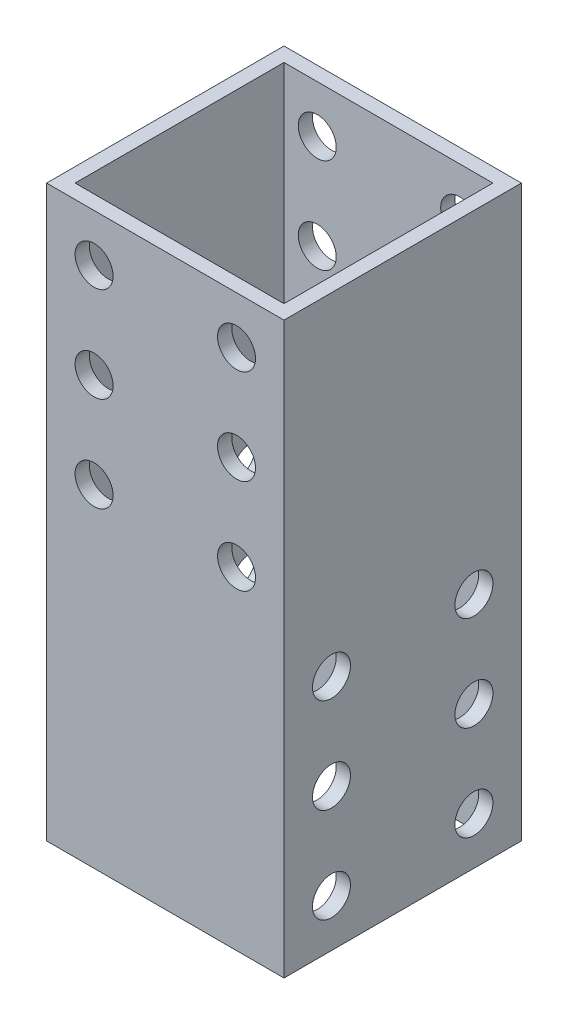
ISO-10303-21;
HEADER;
FILE_DESCRIPTION(('STEP AP214'),'2;1');
FILE_NAME('part.step','',(''),(''),'','','');
FILE_SCHEMA(('AUTOMOTIVE_DESIGN { 1 0 10303 214 1 1 1 1 }'));
ENDSEC;
DATA;
#1=APPLICATION_CONTEXT('core data for automotive mechanical design processes');
#2=APPLICATION_PROTOCOL_DEFINITION('international standard','automotive_design',2000,#1);
#3=PRODUCT_CONTEXT('',#1,'mechanical');
#4=PRODUCT('Part','Part','',(#3));
#5=PRODUCT_RELATED_PRODUCT_CATEGORY('part','',(#4));
#6=PRODUCT_DEFINITION_FORMATION('','',#4);
#7=PRODUCT_DEFINITION_CONTEXT('part definition',#1,'design');
#8=PRODUCT_DEFINITION('design','',#6,#7);
#9=PRODUCT_DEFINITION_SHAPE('','',#8);
#10=(LENGTH_UNIT() NAMED_UNIT(*) SI_UNIT(.MILLI.,.METRE.));
#11=(NAMED_UNIT(*) PLANE_ANGLE_UNIT() SI_UNIT($,.RADIAN.));
#12=(NAMED_UNIT(*) SI_UNIT($,.STERADIAN.) SOLID_ANGLE_UNIT());
#13=UNCERTAINTY_MEASURE_WITH_UNIT(LENGTH_MEASURE(1.E-05),#10,'distance_accuracy_value','');
#14=(GEOMETRIC_REPRESENTATION_CONTEXT(3) GLOBAL_UNCERTAINTY_ASSIGNED_CONTEXT((#13)) GLOBAL_UNIT_ASSIGNED_CONTEXT((#10,
#11,#12)) REPRESENTATION_CONTEXT('',''));
#15=CARTESIAN_POINT('',(0.,0.,0.));
#16=DIRECTION('',(0.,0.,1.));
#17=DIRECTION('',(1.,0.,0.));
#18=AXIS2_PLACEMENT_3D('',#15,#16,#17);
#19=CARTESIAN_POINT('',(12.5,-30.,-12.5));
#20=DIRECTION('',(1.,0.,0.));
#21=DIRECTION('',(0.,0.,-1.));
#22=AXIS2_PLACEMENT_3D('',#19,#20,#21);
#23=PLANE('',#22);
#24=CARTESIAN_POINT('',(12.5,-5.,-7.5));
#25=DIRECTION('',(1.,0.,0.));
#26=DIRECTION('',(0.,0.,-1.));
#27=AXIS2_PLACEMENT_3D('',#24,#25,#26);
#28=CIRCLE('',#27,2.);
#29=CARTESIAN_POINT('',(12.5,-5.,-9.5));
#30=VERTEX_POINT('',#29);
#31=EDGE_CURVE('E238',#30,#30,#28,.T.);
#32=ORIENTED_EDGE('',*,*,#31,.F.);
#33=EDGE_LOOP('',(#32));
#34=FACE_BOUND('',#33,.T.);
#35=CARTESIAN_POINT('',(12.5,-15.,-7.5));
#36=DIRECTION('',(1.,0.,0.));
#37=DIRECTION('',(0.,0.,-1.));
#38=AXIS2_PLACEMENT_3D('',#35,#36,#37);
#39=CIRCLE('',#38,2.);
#40=CARTESIAN_POINT('',(12.5,-15.,-9.5));
#41=VERTEX_POINT('',#40);
#42=EDGE_CURVE('E244',#41,#41,#39,.T.);
#43=ORIENTED_EDGE('',*,*,#42,.F.);
#44=EDGE_LOOP('',(#43));
#45=FACE_BOUND('',#44,.T.);
#46=CARTESIAN_POINT('',(12.5,-25.,7.5));
#47=DIRECTION('',(1.,0.,0.));
#48=DIRECTION('',(0.,0.,-1.));
#49=AXIS2_PLACEMENT_3D('',#46,#47,#48);
#50=CIRCLE('',#49,2.00000000000001);
#51=CARTESIAN_POINT('',(12.5,-25.,5.49999999999999));
#52=VERTEX_POINT('',#51);
#53=EDGE_CURVE('E250',#52,#52,#50,.T.);
#54=ORIENTED_EDGE('',*,*,#53,.F.);
#55=EDGE_LOOP('',(#54));
#56=FACE_BOUND('',#55,.T.);
#57=CARTESIAN_POINT('',(12.5,-5.,7.5));
#58=DIRECTION('',(1.,0.,0.));
#59=DIRECTION('',(0.,0.,-1.));
#60=AXIS2_PLACEMENT_3D('',#57,#58,#59);
#61=CIRCLE('',#60,2.00000000000001);
#62=CARTESIAN_POINT('',(12.5,-5.,5.49999999999999));
#63=VERTEX_POINT('',#62);
#64=EDGE_CURVE('E231',#63,#63,#61,.T.);
#65=ORIENTED_EDGE('',*,*,#64,.F.);
#66=EDGE_LOOP('',(#65));
#67=FACE_BOUND('',#66,.T.);
#68=CARTESIAN_POINT('',(12.5,-15.,7.5));
#69=DIRECTION('',(1.,0.,0.));
#70=DIRECTION('',(0.,0.,-1.));
#71=AXIS2_PLACEMENT_3D('',#68,#69,#70);
#72=CIRCLE('',#71,2.);
#73=CARTESIAN_POINT('',(12.5,-15.,5.49999999999999));
#74=VERTEX_POINT('',#73);
#75=EDGE_CURVE('E227',#74,#74,#72,.T.);
#76=ORIENTED_EDGE('',*,*,#75,.F.);
#77=EDGE_LOOP('',(#76));
#78=FACE_BOUND('',#77,.T.);
#79=CARTESIAN_POINT('',(12.5,-25.,-7.5));
#80=DIRECTION('',(1.,0.,0.));
#81=DIRECTION('',(0.,0.,-1.));
#82=AXIS2_PLACEMENT_3D('',#79,#80,#81);
#83=CIRCLE('',#82,2.);
#84=CARTESIAN_POINT('',(12.5,-25.,-9.5));
#85=VERTEX_POINT('',#84);
#86=EDGE_CURVE('E237',#85,#85,#83,.T.);
#87=ORIENTED_EDGE('',*,*,#86,.F.);
#88=EDGE_LOOP('',(#87));
#89=FACE_BOUND('',#88,.T.);
#90=DIRECTION('',(0.,1.,0.));
#91=VECTOR('',#90,1.);
#92=CARTESIAN_POINT('',(12.5,-30.,-12.5));
#93=LINE('',#92,#91);
#94=CARTESIAN_POINT('',(12.5,-30.,-12.5));
#95=VERTEX_POINT('',#94);
#96=CARTESIAN_POINT('',(12.5,30.,-12.5));
#97=VERTEX_POINT('',#96);
#98=EDGE_CURVE('E164',#95,#97,#93,.T.);
#99=ORIENTED_EDGE('',*,*,#98,.T.);
#100=DIRECTION('',(0.,0.,-1.));
#101=VECTOR('',#100,1.);
#102=CARTESIAN_POINT('',(12.5,30.,-12.5));
#103=LINE('',#102,#101);
#104=CARTESIAN_POINT('',(12.5,30.,12.5));
#105=VERTEX_POINT('',#104);
#106=EDGE_CURVE('E132',#105,#97,#103,.T.);
#107=ORIENTED_EDGE('',*,*,#106,.F.);
#108=DIRECTION('',(0.,1.,0.));
#109=VECTOR('',#108,1.);
#110=CARTESIAN_POINT('',(12.5,-30.,12.5));
#111=LINE('',#110,#109);
#112=CARTESIAN_POINT('',(12.5,-30.,12.5));
#113=VERTEX_POINT('',#112);
#114=EDGE_CURVE('E11',#113,#105,#111,.T.);
#115=ORIENTED_EDGE('',*,*,#114,.F.);
#116=DIRECTION('',(0.,0.,-1.));
#117=VECTOR('',#116,1.);
#118=CARTESIAN_POINT('',(12.5,-30.,-12.5));
#119=LINE('',#118,#117);
#120=EDGE_CURVE('E151',#113,#95,#119,.T.);
#121=ORIENTED_EDGE('',*,*,#120,.T.);
#122=EDGE_LOOP('',(#99,#107,#115,#121));
#123=FACE_BOUND('',#122,.T.);
#124=ADVANCED_FACE('F35',(#34,#45,#56,#67,#78,#89,#123),#23,.T.);
#125=CARTESIAN_POINT('',(-12.5,-30.,12.5));
#126=DIRECTION('',(0.,0.,1.));
#127=DIRECTION('',(1.,0.,0.));
#128=AXIS2_PLACEMENT_3D('',#125,#126,#127);
#129=PLANE('',#128);
#130=CARTESIAN_POINT('',(7.5,15.,12.5));
#131=DIRECTION('',(0.,0.,-1.));
#132=DIRECTION('',(-1.,0.,0.));
#133=AXIS2_PLACEMENT_3D('',#130,#131,#132);
#134=CIRCLE('',#133,2.);
#135=CARTESIAN_POINT('',(5.5,15.,12.5));
#136=VERTEX_POINT('',#135);
#137=EDGE_CURVE('E584',#136,#136,#134,.T.);
#138=ORIENTED_EDGE('',*,*,#137,.T.);
#139=EDGE_LOOP('',(#138));
#140=FACE_BOUND('',#139,.T.);
#141=CARTESIAN_POINT('',(7.5,25.,12.5));
#142=DIRECTION('',(0.,0.,-1.));
#143=DIRECTION('',(-1.,0.,0.));
#144=AXIS2_PLACEMENT_3D('',#141,#142,#143);
#145=CIRCLE('',#144,2.);
#146=CARTESIAN_POINT('',(5.5,25.,12.5));
#147=VERTEX_POINT('',#146);
#148=EDGE_CURVE('E610',#147,#147,#145,.T.);
#149=ORIENTED_EDGE('',*,*,#148,.T.);
#150=EDGE_LOOP('',(#149));
#151=FACE_BOUND('',#150,.T.);
#152=CARTESIAN_POINT('',(7.5,5.,12.5));
#153=DIRECTION('',(0.,0.,-1.));
#154=DIRECTION('',(-1.,0.,0.));
#155=AXIS2_PLACEMENT_3D('',#152,#153,#154);
#156=CIRCLE('',#155,2.);
#157=CARTESIAN_POINT('',(5.5,5.,12.5));
#158=VERTEX_POINT('',#157);
#159=EDGE_CURVE('E609',#158,#158,#156,.T.);
#160=ORIENTED_EDGE('',*,*,#159,.T.);
#161=EDGE_LOOP('',(#160));
#162=FACE_BOUND('',#161,.T.);
#163=CARTESIAN_POINT('',(-7.5,15.,12.5));
#164=DIRECTION('',(0.,0.,-1.));
#165=DIRECTION('',(-1.,0.,0.));
#166=AXIS2_PLACEMENT_3D('',#163,#164,#165);
#167=CIRCLE('',#166,2.);
#168=CARTESIAN_POINT('',(-9.5,15.,12.5));
#169=VERTEX_POINT('',#168);
#170=EDGE_CURVE('E603',#169,#169,#167,.T.);
#171=ORIENTED_EDGE('',*,*,#170,.T.);
#172=EDGE_LOOP('',(#171));
#173=FACE_BOUND('',#172,.T.);
#174=CARTESIAN_POINT('',(-7.5,5.,12.5));
#175=DIRECTION('',(0.,0.,-1.));
#176=DIRECTION('',(-1.,0.,0.));
#177=AXIS2_PLACEMENT_3D('',#174,#175,#176);
#178=CIRCLE('',#177,2.);
#179=CARTESIAN_POINT('',(-9.5,5.,12.5));
#180=VERTEX_POINT('',#179);
#181=EDGE_CURVE('E621',#180,#180,#178,.T.);
#182=ORIENTED_EDGE('',*,*,#181,.T.);
#183=EDGE_LOOP('',(#182));
#184=FACE_BOUND('',#183,.T.);
#185=CARTESIAN_POINT('',(-7.5,25.,12.5));
#186=DIRECTION('',(0.,0.,-1.));
#187=DIRECTION('',(-1.,0.,0.));
#188=AXIS2_PLACEMENT_3D('',#185,#186,#187);
#189=CIRCLE('',#188,2.);
#190=CARTESIAN_POINT('',(-9.5,25.,12.5));
#191=VERTEX_POINT('',#190);
#192=EDGE_CURVE('E198',#191,#191,#189,.T.);
#193=ORIENTED_EDGE('',*,*,#192,.T.);
#194=EDGE_LOOP('',(#193));
#195=FACE_BOUND('',#194,.T.);
#196=ORIENTED_EDGE('',*,*,#114,.T.);
#197=DIRECTION('',(1.,0.,0.));
#198=VECTOR('',#197,1.);
#199=CARTESIAN_POINT('',(-12.5,30.,12.5));
#200=LINE('',#199,#198);
#201=CARTESIAN_POINT('',(-12.5,30.,12.5));
#202=VERTEX_POINT('',#201);
#203=EDGE_CURVE('E141',#202,#105,#200,.T.);
#204=ORIENTED_EDGE('',*,*,#203,.F.);
#205=DIRECTION('',(0.,1.,0.));
#206=VECTOR('',#205,1.);
#207=CARTESIAN_POINT('',(-12.5,-30.,12.5));
#208=LINE('',#207,#206);
#209=CARTESIAN_POINT('',(-12.5,-30.,12.5));
#210=VERTEX_POINT('',#209);
#211=EDGE_CURVE('E43',#210,#202,#208,.T.);
#212=ORIENTED_EDGE('',*,*,#211,.F.);
#213=DIRECTION('',(1.,0.,0.));
#214=VECTOR('',#213,1.);
#215=CARTESIAN_POINT('',(-12.5,-30.,12.5));
#216=LINE('',#215,#214);
#217=EDGE_CURVE('E162',#210,#113,#216,.T.);
#218=ORIENTED_EDGE('',*,*,#217,.T.);
#219=EDGE_LOOP('',(#196,#204,#212,#218));
#220=FACE_BOUND('',#219,.T.);
#221=ADVANCED_FACE('F300',(#140,#151,#162,#173,#184,#195,#220),#129,.T.);
#222=CARTESIAN_POINT('',(-12.5,-30.,-12.5));
#223=DIRECTION('',(-1.,0.,0.));
#224=DIRECTION('',(0.,0.,1.));
#225=AXIS2_PLACEMENT_3D('',#222,#223,#224);
#226=PLANE('',#225);
#227=CARTESIAN_POINT('',(-12.5,-5.,-7.5));
#228=DIRECTION('',(1.,0.,0.));
#229=DIRECTION('',(0.,0.,-1.));
#230=AXIS2_PLACEMENT_3D('',#227,#228,#229);
#231=CIRCLE('',#230,2.);
#232=CARTESIAN_POINT('',(-12.5,-5.,-9.5));
#233=VERTEX_POINT('',#232);
#234=EDGE_CURVE('E234',#233,#233,#231,.T.);
#235=ORIENTED_EDGE('',*,*,#234,.T.);
#236=EDGE_LOOP('',(#235));
#237=FACE_BOUND('',#236,.T.);
#238=CARTESIAN_POINT('',(-12.5,-15.,-7.5));
#239=DIRECTION('',(1.,0.,0.));
#240=DIRECTION('',(0.,0.,-1.));
#241=AXIS2_PLACEMENT_3D('',#238,#239,#240);
#242=CIRCLE('',#241,2.);
#243=CARTESIAN_POINT('',(-12.5,-15.,-9.5));
#244=VERTEX_POINT('',#243);
#245=EDGE_CURVE('E241',#244,#244,#242,.T.);
#246=ORIENTED_EDGE('',*,*,#245,.T.);
#247=EDGE_LOOP('',(#246));
#248=FACE_BOUND('',#247,.T.);
#249=CARTESIAN_POINT('',(-12.5,-25.,7.5));
#250=DIRECTION('',(1.,0.,0.));
#251=DIRECTION('',(0.,0.,-1.));
#252=AXIS2_PLACEMENT_3D('',#249,#250,#251);
#253=CIRCLE('',#252,2.00000000000001);
#254=CARTESIAN_POINT('',(-12.5,-25.,5.49999999999999));
#255=VERTEX_POINT('',#254);
#256=EDGE_CURVE('E247',#255,#255,#253,.T.);
#257=ORIENTED_EDGE('',*,*,#256,.T.);
#258=EDGE_LOOP('',(#257));
#259=FACE_BOUND('',#258,.T.);
#260=CARTESIAN_POINT('',(-12.5,-5.,7.5));
#261=DIRECTION('',(1.,0.,0.));
#262=DIRECTION('',(0.,0.,-1.));
#263=AXIS2_PLACEMENT_3D('',#260,#261,#262);
#264=CIRCLE('',#263,2.00000000000001);
#265=CARTESIAN_POINT('',(-12.5,-5.,5.49999999999999));
#266=VERTEX_POINT('',#265);
#267=EDGE_CURVE('E253',#266,#266,#264,.T.);
#268=ORIENTED_EDGE('',*,*,#267,.T.);
#269=EDGE_LOOP('',(#268));
#270=FACE_BOUND('',#269,.T.);
#271=CARTESIAN_POINT('',(-12.5,-15.,7.5));
#272=DIRECTION('',(1.,0.,0.));
#273=DIRECTION('',(0.,0.,-1.));
#274=AXIS2_PLACEMENT_3D('',#271,#272,#273);
#275=CIRCLE('',#274,2.);
#276=CARTESIAN_POINT('',(-12.5,-15.,5.49999999999999));
#277=VERTEX_POINT('',#276);
#278=EDGE_CURVE('E228',#277,#277,#275,.T.);
#279=ORIENTED_EDGE('',*,*,#278,.T.);
#280=EDGE_LOOP('',(#279));
#281=FACE_BOUND('',#280,.T.);
#282=CARTESIAN_POINT('',(-12.5,-25.,-7.5));
#283=DIRECTION('',(1.,0.,0.));
#284=DIRECTION('',(0.,0.,-1.));
#285=AXIS2_PLACEMENT_3D('',#282,#283,#284);
#286=CIRCLE('',#285,2.);
#287=CARTESIAN_POINT('',(-12.5,-25.,-9.5));
#288=VERTEX_POINT('',#287);
#289=EDGE_CURVE('E174',#288,#288,#286,.T.);
#290=ORIENTED_EDGE('',*,*,#289,.T.);
#291=EDGE_LOOP('',(#290));
#292=FACE_BOUND('',#291,.T.);
#293=ORIENTED_EDGE('',*,*,#211,.T.);
#294=DIRECTION('',(0.,0.,1.));
#295=VECTOR('',#294,1.);
#296=CARTESIAN_POINT('',(-12.5,30.,-12.5));
#297=LINE('',#296,#295);
#298=CARTESIAN_POINT('',(-12.5,30.,-12.5));
#299=VERTEX_POINT('',#298);
#300=EDGE_CURVE('E138',#299,#202,#297,.T.);
#301=ORIENTED_EDGE('',*,*,#300,.F.);
#302=DIRECTION('',(0.,1.,0.));
#303=VECTOR('',#302,1.);
#304=CARTESIAN_POINT('',(-12.5,-30.,-12.5));
#305=LINE('',#304,#303);
#306=CARTESIAN_POINT('',(-12.5,-30.,-12.5));
#307=VERTEX_POINT('',#306);
#308=EDGE_CURVE('E167',#307,#299,#305,.T.);
#309=ORIENTED_EDGE('',*,*,#308,.F.);
#310=DIRECTION('',(0.,0.,1.));
#311=VECTOR('',#310,1.);
#312=CARTESIAN_POINT('',(-12.5,-30.,-12.5));
#313=LINE('',#312,#311);
#314=EDGE_CURVE('E159',#307,#210,#313,.T.);
#315=ORIENTED_EDGE('',*,*,#314,.T.);
#316=EDGE_LOOP('',(#293,#301,#309,#315));
#317=FACE_BOUND('',#316,.T.);
#318=ADVANCED_FACE('F305',(#237,#248,#259,#270,#281,#292,#317),#226,.T.);
#319=CARTESIAN_POINT('',(-12.5,-30.,-12.5));
#320=DIRECTION('',(0.,0.,-1.));
#321=DIRECTION('',(-1.,0.,0.));
#322=AXIS2_PLACEMENT_3D('',#319,#320,#321);
#323=PLANE('',#322);
#324=CARTESIAN_POINT('',(7.5,15.,-12.5));
#325=DIRECTION('',(0.,0.,-1.));
#326=DIRECTION('',(-1.,0.,0.));
#327=AXIS2_PLACEMENT_3D('',#324,#325,#326);
#328=CIRCLE('',#327,2.);
#329=CARTESIAN_POINT('',(5.5,15.,-12.5));
#330=VERTEX_POINT('',#329);
#331=EDGE_CURVE('E618',#330,#330,#328,.T.);
#332=ORIENTED_EDGE('',*,*,#331,.F.);
#333=EDGE_LOOP('',(#332));
#334=FACE_BOUND('',#333,.T.);
#335=CARTESIAN_POINT('',(7.5,25.,-12.5));
#336=DIRECTION('',(0.,0.,-1.));
#337=DIRECTION('',(-1.,0.,0.));
#338=AXIS2_PLACEMENT_3D('',#335,#336,#337);
#339=CIRCLE('',#338,2.);
#340=CARTESIAN_POINT('',(5.5,25.,-12.5));
#341=VERTEX_POINT('',#340);
#342=EDGE_CURVE('E623',#341,#341,#339,.T.);
#343=ORIENTED_EDGE('',*,*,#342,.F.);
#344=EDGE_LOOP('',(#343));
#345=FACE_BOUND('',#344,.T.);
#346=CARTESIAN_POINT('',(7.5,5.,-12.5));
#347=DIRECTION('',(0.,0.,-1.));
#348=DIRECTION('',(-1.,0.,0.));
#349=AXIS2_PLACEMENT_3D('',#346,#347,#348);
#350=CIRCLE('',#349,2.);
#351=CARTESIAN_POINT('',(5.5,5.,-12.5));
#352=VERTEX_POINT('',#351);
#353=EDGE_CURVE('E606',#352,#352,#350,.T.);
#354=ORIENTED_EDGE('',*,*,#353,.F.);
#355=EDGE_LOOP('',(#354));
#356=FACE_BOUND('',#355,.T.);
#357=CARTESIAN_POINT('',(-7.5,15.,-12.5));
#358=DIRECTION('',(0.,0.,-1.));
#359=DIRECTION('',(-1.,0.,0.));
#360=AXIS2_PLACEMENT_3D('',#357,#358,#359);
#361=CIRCLE('',#360,2.);
#362=CARTESIAN_POINT('',(-9.5,15.,-12.5));
#363=VERTEX_POINT('',#362);
#364=EDGE_CURVE('E613',#363,#363,#361,.T.);
#365=ORIENTED_EDGE('',*,*,#364,.F.);
#366=EDGE_LOOP('',(#365));
#367=FACE_BOUND('',#366,.T.);
#368=CARTESIAN_POINT('',(-7.5,5.,-12.5));
#369=DIRECTION('',(0.,0.,-1.));
#370=DIRECTION('',(-1.,0.,0.));
#371=AXIS2_PLACEMENT_3D('',#368,#369,#370);
#372=CIRCLE('',#371,2.);
#373=CARTESIAN_POINT('',(-9.5,5.,-12.5));
#374=VERTEX_POINT('',#373);
#375=EDGE_CURVE('E628',#374,#374,#372,.T.);
#376=ORIENTED_EDGE('',*,*,#375,.F.);
#377=EDGE_LOOP('',(#376));
#378=FACE_BOUND('',#377,.T.);
#379=CARTESIAN_POINT('',(-7.5,25.,-12.5));
#380=DIRECTION('',(0.,0.,-1.));
#381=DIRECTION('',(-1.,0.,0.));
#382=AXIS2_PLACEMENT_3D('',#379,#380,#381);
#383=CIRCLE('',#382,2.);
#384=CARTESIAN_POINT('',(-9.5,25.,-12.5));
#385=VERTEX_POINT('',#384);
#386=EDGE_CURVE('E600',#385,#385,#383,.T.);
#387=ORIENTED_EDGE('',*,*,#386,.F.);
#388=EDGE_LOOP('',(#387));
#389=FACE_BOUND('',#388,.T.);
#390=ORIENTED_EDGE('',*,*,#308,.T.);
#391=DIRECTION('',(-1.,0.,0.));
#392=VECTOR('',#391,1.);
#393=CARTESIAN_POINT('',(-12.5,30.,-12.5));
#394=LINE('',#393,#392);
#395=EDGE_CURVE('E135',#97,#299,#394,.T.);
#396=ORIENTED_EDGE('',*,*,#395,.F.);
#397=ORIENTED_EDGE('',*,*,#98,.F.);
#398=DIRECTION('',(-1.,0.,0.));
#399=VECTOR('',#398,1.);
#400=CARTESIAN_POINT('',(-12.5,-30.,-12.5));
#401=LINE('',#400,#399);
#402=EDGE_CURVE('E156',#95,#307,#401,.T.);
#403=ORIENTED_EDGE('',*,*,#402,.T.);
#404=EDGE_LOOP('',(#390,#396,#397,#403));
#405=FACE_BOUND('',#404,.T.);
#406=ADVANCED_FACE('F322',(#334,#345,#356,#367,#378,#389,#405),#323,.T.);
#407=CARTESIAN_POINT('',(0.,-30.,0.));
#408=DIRECTION('',(0.,1.,0.));
#409=DIRECTION('',(0.,0.,1.));
#410=AXIS2_PLACEMENT_3D('',#407,#408,#409);
#411=PLANE('',#410);
#412=DIRECTION('',(1.,0.,0.));
#413=VECTOR('',#412,1.);
#414=CARTESIAN_POINT('',(-11.,-30.,11.));
#415=LINE('',#414,#413);
#416=CARTESIAN_POINT('',(-11.,-30.,11.));
#417=VERTEX_POINT('',#416);
#418=CARTESIAN_POINT('',(11.,-30.,11.));
#419=VERTEX_POINT('',#418);
#420=EDGE_CURVE('E112',#417,#419,#415,.T.);
#421=ORIENTED_EDGE('',*,*,#420,.T.);
#422=DIRECTION('',(0.,0.,-1.));
#423=VECTOR('',#422,1.);
#424=CARTESIAN_POINT('',(11.,-30.,-11.));
#425=LINE('',#424,#423);
#426=CARTESIAN_POINT('',(11.,-30.,-11.));
#427=VERTEX_POINT('',#426);
#428=EDGE_CURVE('E144',#419,#427,#425,.T.);
#429=ORIENTED_EDGE('',*,*,#428,.T.);
#430=DIRECTION('',(-1.,0.,0.));
#431=VECTOR('',#430,1.);
#432=CARTESIAN_POINT('',(-11.,-30.,-11.));
#433=LINE('',#432,#431);
#434=CARTESIAN_POINT('',(-11.,-30.,-11.));
#435=VERTEX_POINT('',#434);
#436=EDGE_CURVE('E107',#427,#435,#433,.T.);
#437=ORIENTED_EDGE('',*,*,#436,.T.);
#438=DIRECTION('',(0.,0.,1.));
#439=VECTOR('',#438,1.);
#440=CARTESIAN_POINT('',(-11.,-30.,-11.));
#441=LINE('',#440,#439);
#442=EDGE_CURVE('E51',#435,#417,#441,.T.);
#443=ORIENTED_EDGE('',*,*,#442,.T.);
#444=EDGE_LOOP('',(#421,#429,#437,#443));
#445=FACE_BOUND('',#444,.T.);
#446=ORIENTED_EDGE('',*,*,#120,.F.);
#447=ORIENTED_EDGE('',*,*,#217,.F.);
#448=ORIENTED_EDGE('',*,*,#314,.F.);
#449=ORIENTED_EDGE('',*,*,#402,.F.);
#450=EDGE_LOOP('',(#446,#447,#448,#449));
#451=FACE_BOUND('',#450,.T.);
#452=ADVANCED_FACE('F330',(#445,#451),#411,.F.);
#453=CARTESIAN_POINT('',(11.,-30.,-11.));
#454=DIRECTION('',(1.,0.,0.));
#455=DIRECTION('',(0.,0.,-1.));
#456=AXIS2_PLACEMENT_3D('',#453,#454,#455);
#457=PLANE('',#456);
#458=CARTESIAN_POINT('',(11.,-5.,-7.5));
#459=DIRECTION('',(1.,0.,0.));
#460=DIRECTION('',(0.,0.,-1.));
#461=AXIS2_PLACEMENT_3D('',#458,#459,#460);
#462=CIRCLE('',#461,2.);
#463=CARTESIAN_POINT('',(11.,-5.,-9.5));
#464=VERTEX_POINT('',#463);
#465=EDGE_CURVE('E121',#464,#464,#462,.T.);
#466=ORIENTED_EDGE('',*,*,#465,.T.);
#467=EDGE_LOOP('',(#466));
#468=FACE_BOUND('',#467,.T.);
#469=CARTESIAN_POINT('',(11.,-15.,-7.5));
#470=DIRECTION('',(1.,0.,0.));
#471=DIRECTION('',(0.,0.,-1.));
#472=AXIS2_PLACEMENT_3D('',#469,#470,#471);
#473=CIRCLE('',#472,2.);
#474=CARTESIAN_POINT('',(11.,-15.,-9.5));
#475=VERTEX_POINT('',#474);
#476=EDGE_CURVE('E190',#475,#475,#473,.T.);
#477=ORIENTED_EDGE('',*,*,#476,.T.);
#478=EDGE_LOOP('',(#477));
#479=FACE_BOUND('',#478,.T.);
#480=CARTESIAN_POINT('',(11.,-25.,7.5));
#481=DIRECTION('',(1.,0.,0.));
#482=DIRECTION('',(0.,0.,-1.));
#483=AXIS2_PLACEMENT_3D('',#480,#481,#482);
#484=CIRCLE('',#483,2.00000000000001);
#485=CARTESIAN_POINT('',(11.,-25.,5.49999999999999));
#486=VERTEX_POINT('',#485);
#487=EDGE_CURVE('E186',#486,#486,#484,.T.);
#488=ORIENTED_EDGE('',*,*,#487,.T.);
#489=EDGE_LOOP('',(#488));
#490=FACE_BOUND('',#489,.T.);
#491=CARTESIAN_POINT('',(11.,-5.,7.5));
#492=DIRECTION('',(1.,0.,0.));
#493=DIRECTION('',(0.,0.,-1.));
#494=AXIS2_PLACEMENT_3D('',#491,#492,#493);
#495=CIRCLE('',#494,2.00000000000001);
#496=CARTESIAN_POINT('',(11.,-5.,5.49999999999999));
#497=VERTEX_POINT('',#496);
#498=EDGE_CURVE('E182',#497,#497,#495,.T.);
#499=ORIENTED_EDGE('',*,*,#498,.T.);
#500=EDGE_LOOP('',(#499));
#501=FACE_BOUND('',#500,.T.);
#502=CARTESIAN_POINT('',(11.,-15.,7.5));
#503=DIRECTION('',(1.,0.,0.));
#504=DIRECTION('',(0.,0.,-1.));
#505=AXIS2_PLACEMENT_3D('',#502,#503,#504);
#506=CIRCLE('',#505,2.);
#507=CARTESIAN_POINT('',(11.,-15.,5.49999999999999));
#508=VERTEX_POINT('',#507);
#509=EDGE_CURVE('E178',#508,#508,#506,.T.);
#510=ORIENTED_EDGE('',*,*,#509,.T.);
#511=EDGE_LOOP('',(#510));
#512=FACE_BOUND('',#511,.T.);
#513=CARTESIAN_POINT('',(11.,-25.,-7.5));
#514=DIRECTION('',(1.,0.,0.));
#515=DIRECTION('',(0.,0.,-1.));
#516=AXIS2_PLACEMENT_3D('',#513,#514,#515);
#517=CIRCLE('',#516,2.);
#518=CARTESIAN_POINT('',(11.,-25.,-9.5));
#519=VERTEX_POINT('',#518);
#520=EDGE_CURVE('E173',#519,#519,#517,.T.);
#521=ORIENTED_EDGE('',*,*,#520,.T.);
#522=EDGE_LOOP('',(#521));
#523=FACE_BOUND('',#522,.T.);
#524=DIRECTION('',(0.,1.,0.));
#525=VECTOR('',#524,1.);
#526=CARTESIAN_POINT('',(11.,-30.,11.));
#527=LINE('',#526,#525);
#528=CARTESIAN_POINT('',(11.,30.,11.));
#529=VERTEX_POINT('',#528);
#530=EDGE_CURVE('E117',#419,#529,#527,.T.);
#531=ORIENTED_EDGE('',*,*,#530,.T.);
#532=DIRECTION('',(0.,0.,-1.));
#533=VECTOR('',#532,1.);
#534=CARTESIAN_POINT('',(11.,30.,-11.));
#535=LINE('',#534,#533);
#536=CARTESIAN_POINT('',(11.,30.,-11.));
#537=VERTEX_POINT('',#536);
#538=EDGE_CURVE('E115',#529,#537,#535,.T.);
#539=ORIENTED_EDGE('',*,*,#538,.T.);
#540=DIRECTION('',(0.,1.,0.));
#541=VECTOR('',#540,1.);
#542=CARTESIAN_POINT('',(11.,-30.,-11.));
#543=LINE('',#542,#541);
#544=EDGE_CURVE('E100',#427,#537,#543,.T.);
#545=ORIENTED_EDGE('',*,*,#544,.F.);
#546=ORIENTED_EDGE('',*,*,#428,.F.);
#547=EDGE_LOOP('',(#531,#539,#545,#546));
#548=FACE_BOUND('',#547,.T.);
#549=ADVANCED_FACE('F116',(#468,#479,#490,#501,#512,#523,#548),#457,.F.);
#550=CARTESIAN_POINT('',(-11.,-30.,11.));
#551=DIRECTION('',(0.,0.,1.));
#552=DIRECTION('',(1.,0.,0.));
#553=AXIS2_PLACEMENT_3D('',#550,#551,#552);
#554=PLANE('',#553);
#555=CARTESIAN_POINT('',(7.5,15.,11.));
#556=DIRECTION('',(0.,0.,1.));
#557=DIRECTION('',(1.,0.,0.));
#558=AXIS2_PLACEMENT_3D('',#555,#556,#557);
#559=CIRCLE('',#558,2.);
#560=CARTESIAN_POINT('',(9.5,15.,11.));
#561=VERTEX_POINT('',#560);
#562=EDGE_CURVE('E224',#561,#561,#559,.T.);
#563=ORIENTED_EDGE('',*,*,#562,.T.);
#564=EDGE_LOOP('',(#563));
#565=FACE_BOUND('',#564,.T.);
#566=CARTESIAN_POINT('',(7.5,25.,11.));
#567=DIRECTION('',(0.,0.,1.));
#568=DIRECTION('',(1.,0.,0.));
#569=AXIS2_PLACEMENT_3D('',#566,#567,#568);
#570=CIRCLE('',#569,2.);
#571=CARTESIAN_POINT('',(9.5,25.,11.));
#572=VERTEX_POINT('',#571);
#573=EDGE_CURVE('E212',#572,#572,#570,.T.);
#574=ORIENTED_EDGE('',*,*,#573,.T.);
#575=EDGE_LOOP('',(#574));
#576=FACE_BOUND('',#575,.T.);
#577=CARTESIAN_POINT('',(7.5,5.,11.));
#578=DIRECTION('',(0.,0.,1.));
#579=DIRECTION('',(1.,0.,0.));
#580=AXIS2_PLACEMENT_3D('',#577,#578,#579);
#581=CIRCLE('',#580,2.);
#582=CARTESIAN_POINT('',(9.5,5.,11.));
#583=VERTEX_POINT('',#582);
#584=EDGE_CURVE('E209',#583,#583,#581,.T.);
#585=ORIENTED_EDGE('',*,*,#584,.T.);
#586=EDGE_LOOP('',(#585));
#587=FACE_BOUND('',#586,.T.);
#588=CARTESIAN_POINT('',(-7.5,15.,11.));
#589=DIRECTION('',(0.,0.,1.));
#590=DIRECTION('',(1.,0.,0.));
#591=AXIS2_PLACEMENT_3D('',#588,#589,#590);
#592=CIRCLE('',#591,2.);
#593=CARTESIAN_POINT('',(-5.5,15.,11.));
#594=VERTEX_POINT('',#593);
#595=EDGE_CURVE('E206',#594,#594,#592,.T.);
#596=ORIENTED_EDGE('',*,*,#595,.T.);
#597=EDGE_LOOP('',(#596));
#598=FACE_BOUND('',#597,.T.);
#599=CARTESIAN_POINT('',(-7.5,5.,11.));
#600=DIRECTION('',(0.,0.,1.));
#601=DIRECTION('',(1.,0.,0.));
#602=AXIS2_PLACEMENT_3D('',#599,#600,#601);
#603=CIRCLE('',#602,2.);
#604=CARTESIAN_POINT('',(-5.5,5.,11.));
#605=VERTEX_POINT('',#604);
#606=EDGE_CURVE('E202',#605,#605,#603,.T.);
#607=ORIENTED_EDGE('',*,*,#606,.T.);
#608=EDGE_LOOP('',(#607));
#609=FACE_BOUND('',#608,.T.);
#610=CARTESIAN_POINT('',(-7.5,25.,11.));
#611=DIRECTION('',(0.,0.,1.));
#612=DIRECTION('',(1.,0.,0.));
#613=AXIS2_PLACEMENT_3D('',#610,#611,#612);
#614=CIRCLE('',#613,2.);
#615=CARTESIAN_POINT('',(-5.5,25.,11.));
#616=VERTEX_POINT('',#615);
#617=EDGE_CURVE('E197',#616,#616,#614,.T.);
#618=ORIENTED_EDGE('',*,*,#617,.T.);
#619=EDGE_LOOP('',(#618));
#620=FACE_BOUND('',#619,.T.);
#621=DIRECTION('',(0.,1.,0.));
#622=VECTOR('',#621,1.);
#623=CARTESIAN_POINT('',(-11.,-30.,11.));
#624=LINE('',#623,#622);
#625=CARTESIAN_POINT('',(-11.,30.,11.));
#626=VERTEX_POINT('',#625);
#627=EDGE_CURVE('E152',#417,#626,#624,.T.);
#628=ORIENTED_EDGE('',*,*,#627,.T.);
#629=DIRECTION('',(1.,0.,0.));
#630=VECTOR('',#629,1.);
#631=CARTESIAN_POINT('',(-11.,30.,11.));
#632=LINE('',#631,#630);
#633=EDGE_CURVE('E127',#626,#529,#632,.T.);
#634=ORIENTED_EDGE('',*,*,#633,.T.);
#635=ORIENTED_EDGE('',*,*,#530,.F.);
#636=ORIENTED_EDGE('',*,*,#420,.F.);
#637=EDGE_LOOP('',(#628,#634,#635,#636));
#638=FACE_BOUND('',#637,.T.);
#639=ADVANCED_FACE('F346',(#565,#576,#587,#598,#609,#620,#638),#554,.F.);
#640=CARTESIAN_POINT('',(-11.,-30.,-11.));
#641=DIRECTION('',(-1.,0.,0.));
#642=DIRECTION('',(0.,0.,1.));
#643=AXIS2_PLACEMENT_3D('',#640,#641,#642);
#644=PLANE('',#643);
#645=CARTESIAN_POINT('',(-11.,-5.,-7.5));
#646=DIRECTION('',(-1.,0.,0.));
#647=DIRECTION('',(0.,0.,1.));
#648=AXIS2_PLACEMENT_3D('',#645,#646,#647);
#649=CIRCLE('',#648,2.);
#650=CARTESIAN_POINT('',(-11.,-5.,-5.50000000000001));
#651=VERTEX_POINT('',#650);
#652=EDGE_CURVE('E191',#651,#651,#649,.T.);
#653=ORIENTED_EDGE('',*,*,#652,.T.);
#654=EDGE_LOOP('',(#653));
#655=FACE_BOUND('',#654,.T.);
#656=CARTESIAN_POINT('',(-11.,-15.,-7.5));
#657=DIRECTION('',(-1.,0.,0.));
#658=DIRECTION('',(0.,0.,1.));
#659=AXIS2_PLACEMENT_3D('',#656,#657,#658);
#660=CIRCLE('',#659,2.);
#661=CARTESIAN_POINT('',(-11.,-15.,-5.5));
#662=VERTEX_POINT('',#661);
#663=EDGE_CURVE('E187',#662,#662,#660,.T.);
#664=ORIENTED_EDGE('',*,*,#663,.T.);
#665=EDGE_LOOP('',(#664));
#666=FACE_BOUND('',#665,.T.);
#667=CARTESIAN_POINT('',(-11.,-25.,7.5));
#668=DIRECTION('',(-1.,0.,0.));
#669=DIRECTION('',(0.,0.,1.));
#670=AXIS2_PLACEMENT_3D('',#667,#668,#669);
#671=CIRCLE('',#670,2.00000000000001);
#672=CARTESIAN_POINT('',(-11.,-25.,9.5));
#673=VERTEX_POINT('',#672);
#674=EDGE_CURVE('E183',#673,#673,#671,.T.);
#675=ORIENTED_EDGE('',*,*,#674,.T.);
#676=EDGE_LOOP('',(#675));
#677=FACE_BOUND('',#676,.T.);
#678=CARTESIAN_POINT('',(-11.,-5.,7.5));
#679=DIRECTION('',(-1.,0.,0.));
#680=DIRECTION('',(0.,0.,1.));
#681=AXIS2_PLACEMENT_3D('',#678,#679,#680);
#682=CIRCLE('',#681,2.00000000000001);
#683=CARTESIAN_POINT('',(-11.,-5.,9.50000000000001));
#684=VERTEX_POINT('',#683);
#685=EDGE_CURVE('E179',#684,#684,#682,.T.);
#686=ORIENTED_EDGE('',*,*,#685,.T.);
#687=EDGE_LOOP('',(#686));
#688=FACE_BOUND('',#687,.T.);
#689=CARTESIAN_POINT('',(-11.,-15.,7.5));
#690=DIRECTION('',(-1.,0.,0.));
#691=DIRECTION('',(0.,0.,1.));
#692=AXIS2_PLACEMENT_3D('',#689,#690,#691);
#693=CIRCLE('',#692,2.);
#694=CARTESIAN_POINT('',(-11.,-15.,9.5));
#695=VERTEX_POINT('',#694);
#696=EDGE_CURVE('E175',#695,#695,#693,.T.);
#697=ORIENTED_EDGE('',*,*,#696,.T.);
#698=EDGE_LOOP('',(#697));
#699=FACE_BOUND('',#698,.T.);
#700=CARTESIAN_POINT('',(-11.,-25.,-7.5));
#701=DIRECTION('',(-1.,0.,0.));
#702=DIRECTION('',(0.,0.,1.));
#703=AXIS2_PLACEMENT_3D('',#700,#701,#702);
#704=CIRCLE('',#703,2.);
#705=CARTESIAN_POINT('',(-11.,-25.,-5.5));
#706=VERTEX_POINT('',#705);
#707=EDGE_CURVE('E170',#706,#706,#704,.T.);
#708=ORIENTED_EDGE('',*,*,#707,.T.);
#709=EDGE_LOOP('',(#708));
#710=FACE_BOUND('',#709,.T.);
#711=DIRECTION('',(0.,1.,0.));
#712=VECTOR('',#711,1.);
#713=CARTESIAN_POINT('',(-11.,-30.,-11.));
#714=LINE('',#713,#712);
#715=CARTESIAN_POINT('',(-11.,30.,-11.));
#716=VERTEX_POINT('',#715);
#717=EDGE_CURVE('E111',#435,#716,#714,.T.);
#718=ORIENTED_EDGE('',*,*,#717,.T.);
#719=DIRECTION('',(0.,0.,1.));
#720=VECTOR('',#719,1.);
#721=CARTESIAN_POINT('',(-11.,30.,-11.));
#722=LINE('',#721,#720);
#723=EDGE_CURVE('E125',#716,#626,#722,.T.);
#724=ORIENTED_EDGE('',*,*,#723,.T.);
#725=ORIENTED_EDGE('',*,*,#627,.F.);
#726=ORIENTED_EDGE('',*,*,#442,.F.);
#727=EDGE_LOOP('',(#718,#724,#725,#726));
#728=FACE_BOUND('',#727,.T.);
#729=ADVANCED_FACE('F349',(#655,#666,#677,#688,#699,#710,#728),#644,.F.);
#730=CARTESIAN_POINT('',(-11.,-30.,-11.));
#731=DIRECTION('',(0.,0.,-1.));
#732=DIRECTION('',(-1.,0.,0.));
#733=AXIS2_PLACEMENT_3D('',#730,#731,#732);
#734=PLANE('',#733);
#735=CARTESIAN_POINT('',(7.5,15.,-11.));
#736=DIRECTION('',(0.,0.,-1.));
#737=DIRECTION('',(-1.,0.,0.));
#738=AXIS2_PLACEMENT_3D('',#735,#736,#737);
#739=CIRCLE('',#738,2.);
#740=CARTESIAN_POINT('',(5.5,15.,-11.));
#741=VERTEX_POINT('',#740);
#742=EDGE_CURVE('E38',#741,#741,#739,.T.);
#743=ORIENTED_EDGE('',*,*,#742,.T.);
#744=EDGE_LOOP('',(#743));
#745=FACE_BOUND('',#744,.T.);
#746=CARTESIAN_POINT('',(7.5,25.,-11.));
#747=DIRECTION('',(0.,0.,-1.));
#748=DIRECTION('',(-1.,0.,0.));
#749=AXIS2_PLACEMENT_3D('',#746,#747,#748);
#750=CIRCLE('',#749,2.);
#751=CARTESIAN_POINT('',(5.5,25.,-11.));
#752=VERTEX_POINT('',#751);
#753=EDGE_CURVE('E210',#752,#752,#750,.T.);
#754=ORIENTED_EDGE('',*,*,#753,.T.);
#755=EDGE_LOOP('',(#754));
#756=FACE_BOUND('',#755,.T.);
#757=CARTESIAN_POINT('',(7.5,5.,-11.));
#758=DIRECTION('',(0.,0.,-1.));
#759=DIRECTION('',(-1.,0.,0.));
#760=AXIS2_PLACEMENT_3D('',#757,#758,#759);
#761=CIRCLE('',#760,2.);
#762=CARTESIAN_POINT('',(5.5,5.,-11.));
#763=VERTEX_POINT('',#762);
#764=EDGE_CURVE('E207',#763,#763,#761,.T.);
#765=ORIENTED_EDGE('',*,*,#764,.T.);
#766=EDGE_LOOP('',(#765));
#767=FACE_BOUND('',#766,.T.);
#768=CARTESIAN_POINT('',(-7.5,15.,-11.));
#769=DIRECTION('',(0.,0.,-1.));
#770=DIRECTION('',(-1.,0.,0.));
#771=AXIS2_PLACEMENT_3D('',#768,#769,#770);
#772=CIRCLE('',#771,2.);
#773=CARTESIAN_POINT('',(-9.5,15.,-11.));
#774=VERTEX_POINT('',#773);
#775=EDGE_CURVE('E203',#774,#774,#772,.T.);
#776=ORIENTED_EDGE('',*,*,#775,.T.);
#777=EDGE_LOOP('',(#776));
#778=FACE_BOUND('',#777,.T.);
#779=CARTESIAN_POINT('',(-7.5,5.,-11.));
#780=DIRECTION('',(0.,0.,-1.));
#781=DIRECTION('',(-1.,0.,0.));
#782=AXIS2_PLACEMENT_3D('',#779,#780,#781);
#783=CIRCLE('',#782,2.);
#784=CARTESIAN_POINT('',(-9.5,5.,-11.));
#785=VERTEX_POINT('',#784);
#786=EDGE_CURVE('E199',#785,#785,#783,.T.);
#787=ORIENTED_EDGE('',*,*,#786,.T.);
#788=EDGE_LOOP('',(#787));
#789=FACE_BOUND('',#788,.T.);
#790=CARTESIAN_POINT('',(-7.5,25.,-11.));
#791=DIRECTION('',(0.,0.,-1.));
#792=DIRECTION('',(-1.,0.,0.));
#793=AXIS2_PLACEMENT_3D('',#790,#791,#792);
#794=CIRCLE('',#793,2.);
#795=CARTESIAN_POINT('',(-9.5,25.,-11.));
#796=VERTEX_POINT('',#795);
#797=EDGE_CURVE('E194',#796,#796,#794,.T.);
#798=ORIENTED_EDGE('',*,*,#797,.T.);
#799=EDGE_LOOP('',(#798));
#800=FACE_BOUND('',#799,.T.);
#801=ORIENTED_EDGE('',*,*,#544,.T.);
#802=DIRECTION('',(-1.,0.,0.));
#803=VECTOR('',#802,1.);
#804=CARTESIAN_POINT('',(-11.,30.,-11.));
#805=LINE('',#804,#803);
#806=EDGE_CURVE('E104',#537,#716,#805,.T.);
#807=ORIENTED_EDGE('',*,*,#806,.T.);
#808=ORIENTED_EDGE('',*,*,#717,.F.);
#809=ORIENTED_EDGE('',*,*,#436,.F.);
#810=EDGE_LOOP('',(#801,#807,#808,#809));
#811=FACE_BOUND('',#810,.T.);
#812=ADVANCED_FACE('F102',(#745,#756,#767,#778,#789,#800,#811),#734,.F.);
#813=CARTESIAN_POINT('',(0.,30.,0.));
#814=DIRECTION('',(0.,1.,0.));
#815=DIRECTION('',(0.,0.,1.));
#816=AXIS2_PLACEMENT_3D('',#813,#814,#815);
#817=PLANE('',#816);
#818=ORIENTED_EDGE('',*,*,#106,.T.);
#819=ORIENTED_EDGE('',*,*,#395,.T.);
#820=ORIENTED_EDGE('',*,*,#300,.T.);
#821=ORIENTED_EDGE('',*,*,#203,.T.);
#822=EDGE_LOOP('',(#818,#819,#820,#821));
#823=FACE_BOUND('',#822,.T.);
#824=ORIENTED_EDGE('',*,*,#806,.F.);
#825=ORIENTED_EDGE('',*,*,#538,.F.);
#826=ORIENTED_EDGE('',*,*,#633,.F.);
#827=ORIENTED_EDGE('',*,*,#723,.F.);
#828=EDGE_LOOP('',(#824,#825,#826,#827));
#829=FACE_BOUND('',#828,.T.);
#830=ADVANCED_FACE('F123',(#823,#829),#817,.T.);
#831=CARTESIAN_POINT('',(-12.5,-25.,-7.5));
#832=DIRECTION('',(1.,0.,0.));
#833=DIRECTION('',(0.,0.,-1.));
#834=AXIS2_PLACEMENT_3D('',#831,#832,#833);
#835=CYLINDRICAL_SURFACE('',#834,2.);
#836=ORIENTED_EDGE('',*,*,#289,.F.);
#837=EDGE_LOOP('',(#836));
#838=FACE_BOUND('',#837,.T.);
#839=ORIENTED_EDGE('',*,*,#707,.F.);
#840=EDGE_LOOP('',(#839));
#841=FACE_BOUND('',#840,.T.);
#842=ADVANCED_FACE('F359',(#838,#841),#835,.F.);
#843=CARTESIAN_POINT('',(-12.5,-15.,7.5));
#844=DIRECTION('',(1.,0.,0.));
#845=DIRECTION('',(0.,0.,-1.));
#846=AXIS2_PLACEMENT_3D('',#843,#844,#845);
#847=CYLINDRICAL_SURFACE('',#846,2.);
#848=ORIENTED_EDGE('',*,*,#278,.F.);
#849=EDGE_LOOP('',(#848));
#850=FACE_BOUND('',#849,.T.);
#851=ORIENTED_EDGE('',*,*,#696,.F.);
#852=EDGE_LOOP('',(#851));
#853=FACE_BOUND('',#852,.T.);
#854=ADVANCED_FACE('F382',(#850,#853),#847,.F.);
#855=CARTESIAN_POINT('',(-12.5,-5.,7.5));
#856=DIRECTION('',(1.,0.,0.));
#857=DIRECTION('',(0.,0.,-1.));
#858=AXIS2_PLACEMENT_3D('',#855,#856,#857);
#859=CYLINDRICAL_SURFACE('',#858,2.00000000000001);
#860=ORIENTED_EDGE('',*,*,#267,.F.);
#861=EDGE_LOOP('',(#860));
#862=FACE_BOUND('',#861,.T.);
#863=ORIENTED_EDGE('',*,*,#685,.F.);
#864=EDGE_LOOP('',(#863));
#865=FACE_BOUND('',#864,.T.);
#866=ADVANCED_FACE('F368',(#862,#865),#859,.F.);
#867=CARTESIAN_POINT('',(-12.5,-25.,7.5));
#868=DIRECTION('',(1.,0.,0.));
#869=DIRECTION('',(0.,0.,-1.));
#870=AXIS2_PLACEMENT_3D('',#867,#868,#869);
#871=CYLINDRICAL_SURFACE('',#870,2.00000000000001);
#872=ORIENTED_EDGE('',*,*,#256,.F.);
#873=EDGE_LOOP('',(#872));
#874=FACE_BOUND('',#873,.T.);
#875=ORIENTED_EDGE('',*,*,#674,.F.);
#876=EDGE_LOOP('',(#875));
#877=FACE_BOUND('',#876,.T.);
#878=ADVANCED_FACE('F371',(#874,#877),#871,.F.);
#879=CARTESIAN_POINT('',(-12.5,-15.,-7.5));
#880=DIRECTION('',(1.,0.,0.));
#881=DIRECTION('',(0.,0.,-1.));
#882=AXIS2_PLACEMENT_3D('',#879,#880,#881);
#883=CYLINDRICAL_SURFACE('',#882,2.);
#884=ORIENTED_EDGE('',*,*,#245,.F.);
#885=EDGE_LOOP('',(#884));
#886=FACE_BOUND('',#885,.T.);
#887=ORIENTED_EDGE('',*,*,#663,.F.);
#888=EDGE_LOOP('',(#887));
#889=FACE_BOUND('',#888,.T.);
#890=ADVANCED_FACE('F294',(#886,#889),#883,.F.);
#891=CARTESIAN_POINT('',(-12.5,-5.,-7.5));
#892=DIRECTION('',(1.,0.,0.));
#893=DIRECTION('',(0.,0.,-1.));
#894=AXIS2_PLACEMENT_3D('',#891,#892,#893);
#895=CYLINDRICAL_SURFACE('',#894,2.);
#896=ORIENTED_EDGE('',*,*,#234,.F.);
#897=EDGE_LOOP('',(#896));
#898=FACE_BOUND('',#897,.T.);
#899=ORIENTED_EDGE('',*,*,#652,.F.);
#900=EDGE_LOOP('',(#899));
#901=FACE_BOUND('',#900,.T.);
#902=ADVANCED_FACE('F282',(#898,#901),#895,.F.);
#903=ORIENTED_EDGE('',*,*,#86,.T.);
#904=EDGE_LOOP('',(#903));
#905=FACE_BOUND('',#904,.T.);
#906=ORIENTED_EDGE('',*,*,#520,.F.);
#907=EDGE_LOOP('',(#906));
#908=FACE_BOUND('',#907,.T.);
#909=ADVANCED_FACE('F297',(#905,#908),#835,.F.);
#910=ORIENTED_EDGE('',*,*,#75,.T.);
#911=EDGE_LOOP('',(#910));
#912=FACE_BOUND('',#911,.T.);
#913=ORIENTED_EDGE('',*,*,#509,.F.);
#914=EDGE_LOOP('',(#913));
#915=FACE_BOUND('',#914,.T.);
#916=ADVANCED_FACE('F362',(#912,#915),#847,.F.);
#917=ORIENTED_EDGE('',*,*,#64,.T.);
#918=EDGE_LOOP('',(#917));
#919=FACE_BOUND('',#918,.T.);
#920=ORIENTED_EDGE('',*,*,#498,.F.);
#921=EDGE_LOOP('',(#920));
#922=FACE_BOUND('',#921,.T.);
#923=ADVANCED_FACE('F364',(#919,#922),#859,.F.);
#924=ORIENTED_EDGE('',*,*,#53,.T.);
#925=EDGE_LOOP('',(#924));
#926=FACE_BOUND('',#925,.T.);
#927=ORIENTED_EDGE('',*,*,#487,.F.);
#928=EDGE_LOOP('',(#927));
#929=FACE_BOUND('',#928,.T.);
#930=ADVANCED_FACE('F291',(#926,#929),#871,.F.);
#931=ORIENTED_EDGE('',*,*,#42,.T.);
#932=EDGE_LOOP('',(#931));
#933=FACE_BOUND('',#932,.T.);
#934=ORIENTED_EDGE('',*,*,#476,.F.);
#935=EDGE_LOOP('',(#934));
#936=FACE_BOUND('',#935,.T.);
#937=ADVANCED_FACE('F279',(#933,#936),#883,.F.);
#938=ORIENTED_EDGE('',*,*,#31,.T.);
#939=EDGE_LOOP('',(#938));
#940=FACE_BOUND('',#939,.T.);
#941=ORIENTED_EDGE('',*,*,#465,.F.);
#942=EDGE_LOOP('',(#941));
#943=FACE_BOUND('',#942,.T.);
#944=ADVANCED_FACE('F276',(#940,#943),#895,.F.);
#945=CARTESIAN_POINT('',(-7.5,25.,12.5));
#946=DIRECTION('',(0.,0.,-1.));
#947=DIRECTION('',(-1.,0.,0.));
#948=AXIS2_PLACEMENT_3D('',#945,#946,#947);
#949=CYLINDRICAL_SURFACE('',#948,2.);
#950=ORIENTED_EDGE('',*,*,#386,.T.);
#951=EDGE_LOOP('',(#950));
#952=FACE_BOUND('',#951,.T.);
#953=ORIENTED_EDGE('',*,*,#797,.F.);
#954=EDGE_LOOP('',(#953));
#955=FACE_BOUND('',#954,.T.);
#956=ADVANCED_FACE('F278',(#952,#955),#949,.F.);
#957=CARTESIAN_POINT('',(-7.5,5.,12.5));
#958=DIRECTION('',(0.,0.,-1.));
#959=DIRECTION('',(-1.,0.,0.));
#960=AXIS2_PLACEMENT_3D('',#957,#958,#959);
#961=CYLINDRICAL_SURFACE('',#960,2.);
#962=ORIENTED_EDGE('',*,*,#375,.T.);
#963=EDGE_LOOP('',(#962));
#964=FACE_BOUND('',#963,.T.);
#965=ORIENTED_EDGE('',*,*,#786,.F.);
#966=EDGE_LOOP('',(#965));
#967=FACE_BOUND('',#966,.T.);
#968=ADVANCED_FACE('F287',(#964,#967),#961,.F.);
#969=CARTESIAN_POINT('',(-7.5,15.,12.5));
#970=DIRECTION('',(0.,0.,-1.));
#971=DIRECTION('',(-1.,0.,0.));
#972=AXIS2_PLACEMENT_3D('',#969,#970,#971);
#973=CYLINDRICAL_SURFACE('',#972,2.);
#974=ORIENTED_EDGE('',*,*,#364,.T.);
#975=EDGE_LOOP('',(#974));
#976=FACE_BOUND('',#975,.T.);
#977=ORIENTED_EDGE('',*,*,#775,.F.);
#978=EDGE_LOOP('',(#977));
#979=FACE_BOUND('',#978,.T.);
#980=ADVANCED_FACE('F484',(#976,#979),#973,.F.);
#981=CARTESIAN_POINT('',(7.5,5.,12.5));
#982=DIRECTION('',(0.,0.,-1.));
#983=DIRECTION('',(-1.,0.,0.));
#984=AXIS2_PLACEMENT_3D('',#981,#982,#983);
#985=CYLINDRICAL_SURFACE('',#984,2.);
#986=ORIENTED_EDGE('',*,*,#353,.T.);
#987=EDGE_LOOP('',(#986));
#988=FACE_BOUND('',#987,.T.);
#989=ORIENTED_EDGE('',*,*,#764,.F.);
#990=EDGE_LOOP('',(#989));
#991=FACE_BOUND('',#990,.T.);
#992=ADVANCED_FACE('F495',(#988,#991),#985,.F.);
#993=CARTESIAN_POINT('',(7.5,25.,12.5));
#994=DIRECTION('',(0.,0.,-1.));
#995=DIRECTION('',(-1.,0.,0.));
#996=AXIS2_PLACEMENT_3D('',#993,#994,#995);
#997=CYLINDRICAL_SURFACE('',#996,2.);
#998=ORIENTED_EDGE('',*,*,#342,.T.);
#999=EDGE_LOOP('',(#998));
#1000=FACE_BOUND('',#999,.T.);
#1001=ORIENTED_EDGE('',*,*,#753,.F.);
#1002=EDGE_LOOP('',(#1001));
#1003=FACE_BOUND('',#1002,.T.);
#1004=ADVANCED_FACE('F506',(#1000,#1003),#997,.F.);
#1005=CARTESIAN_POINT('',(7.5,15.,12.5));
#1006=DIRECTION('',(0.,0.,-1.));
#1007=DIRECTION('',(-1.,0.,0.));
#1008=AXIS2_PLACEMENT_3D('',#1005,#1006,#1007);
#1009=CYLINDRICAL_SURFACE('',#1008,2.);
#1010=ORIENTED_EDGE('',*,*,#331,.T.);
#1011=EDGE_LOOP('',(#1010));
#1012=FACE_BOUND('',#1011,.T.);
#1013=ORIENTED_EDGE('',*,*,#742,.F.);
#1014=EDGE_LOOP('',(#1013));
#1015=FACE_BOUND('',#1014,.T.);
#1016=ADVANCED_FACE('F517',(#1012,#1015),#1009,.F.);
#1017=ORIENTED_EDGE('',*,*,#192,.F.);
#1018=EDGE_LOOP('',(#1017));
#1019=FACE_BOUND('',#1018,.T.);
#1020=ORIENTED_EDGE('',*,*,#617,.F.);
#1021=EDGE_LOOP('',(#1020));
#1022=FACE_BOUND('',#1021,.T.);
#1023=ADVANCED_FACE('F290',(#1019,#1022),#949,.F.);
#1024=ORIENTED_EDGE('',*,*,#181,.F.);
#1025=EDGE_LOOP('',(#1024));
#1026=FACE_BOUND('',#1025,.T.);
#1027=ORIENTED_EDGE('',*,*,#606,.F.);
#1028=EDGE_LOOP('',(#1027));
#1029=FACE_BOUND('',#1028,.T.);
#1030=ADVANCED_FACE('F487',(#1026,#1029),#961,.F.);
#1031=ORIENTED_EDGE('',*,*,#170,.F.);
#1032=EDGE_LOOP('',(#1031));
#1033=FACE_BOUND('',#1032,.T.);
#1034=ORIENTED_EDGE('',*,*,#595,.F.);
#1035=EDGE_LOOP('',(#1034));
#1036=FACE_BOUND('',#1035,.T.);
#1037=ADVANCED_FACE('F498',(#1033,#1036),#973,.F.);
#1038=ORIENTED_EDGE('',*,*,#159,.F.);
#1039=EDGE_LOOP('',(#1038));
#1040=FACE_BOUND('',#1039,.T.);
#1041=ORIENTED_EDGE('',*,*,#584,.F.);
#1042=EDGE_LOOP('',(#1041));
#1043=FACE_BOUND('',#1042,.T.);
#1044=ADVANCED_FACE('F509',(#1040,#1043),#985,.F.);
#1045=ORIENTED_EDGE('',*,*,#148,.F.);
#1046=EDGE_LOOP('',(#1045));
#1047=FACE_BOUND('',#1046,.T.);
#1048=ORIENTED_EDGE('',*,*,#573,.F.);
#1049=EDGE_LOOP('',(#1048));
#1050=FACE_BOUND('',#1049,.T.);
#1051=ADVANCED_FACE('F520',(#1047,#1050),#997,.F.);
#1052=ORIENTED_EDGE('',*,*,#137,.F.);
#1053=EDGE_LOOP('',(#1052));
#1054=FACE_BOUND('',#1053,.T.);
#1055=ORIENTED_EDGE('',*,*,#562,.F.);
#1056=EDGE_LOOP('',(#1055));
#1057=FACE_BOUND('',#1056,.T.);
#1058=ADVANCED_FACE('F530',(#1054,#1057),#1009,.F.);
#1059=CLOSED_SHELL('',(#124,#221,#318,#406,#452,#549,#639,#729,#812,#830,#842,#854,#866,#878,
#890,#902,#909,#916,#923,#930,#937,#944,#956,#968,#980,#992,#1004,#1016,#1023,#1030,#1037,#1044,
#1051,#1058));
#1060=MANIFOLD_SOLID_BREP('B2',#1059);
#1061=ADVANCED_BREP_SHAPE_REPRESENTATION('',(#18,#1060),#14);
#1062=SHAPE_DEFINITION_REPRESENTATION(#9,#1061);
ENDSEC;
END-ISO-10303-21;
